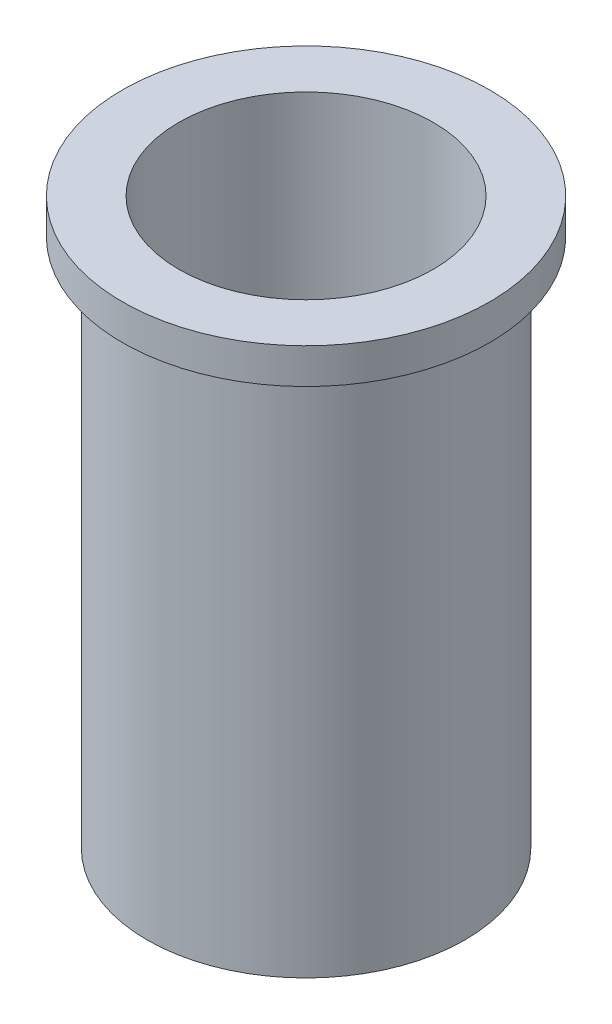
ISO-10303-21;
HEADER;
FILE_DESCRIPTION(('STEP AP214'),'2;1');
FILE_NAME('part.step','',(''),(''),'','','');
FILE_SCHEMA(('AUTOMOTIVE_DESIGN { 1 0 10303 214 1 1 1 1 }'));
ENDSEC;
DATA;
#1=APPLICATION_CONTEXT('core data for automotive mechanical design processes');
#2=APPLICATION_PROTOCOL_DEFINITION('international standard','automotive_design',2000,#1);
#3=PRODUCT_CONTEXT('',#1,'mechanical');
#4=PRODUCT('Part','Part','',(#3));
#5=PRODUCT_RELATED_PRODUCT_CATEGORY('part','',(#4));
#6=PRODUCT_DEFINITION_FORMATION('','',#4);
#7=PRODUCT_DEFINITION_CONTEXT('part definition',#1,'design');
#8=PRODUCT_DEFINITION('design','',#6,#7);
#9=PRODUCT_DEFINITION_SHAPE('','',#8);
#10=(LENGTH_UNIT() NAMED_UNIT(*) SI_UNIT(.MILLI.,.METRE.));
#11=(NAMED_UNIT(*) PLANE_ANGLE_UNIT() SI_UNIT($,.RADIAN.));
#12=(NAMED_UNIT(*) SI_UNIT($,.STERADIAN.) SOLID_ANGLE_UNIT());
#13=UNCERTAINTY_MEASURE_WITH_UNIT(LENGTH_MEASURE(1.E-05),#10,'distance_accuracy_value','');
#14=(GEOMETRIC_REPRESENTATION_CONTEXT(3) GLOBAL_UNCERTAINTY_ASSIGNED_CONTEXT((#13)) GLOBAL_UNIT_ASSIGNED_CONTEXT((#10,
#11,#12)) REPRESENTATION_CONTEXT('',''));
#15=CARTESIAN_POINT('',(0.,0.,0.));
#16=DIRECTION('',(0.,0.,1.));
#17=DIRECTION('',(1.,0.,0.));
#18=AXIS2_PLACEMENT_3D('',#15,#16,#17);
#19=CARTESIAN_POINT('',(16.51,50.8,0.));
#20=DIRECTION('',(0.,1.,0.));
#21=DIRECTION('',(0.,0.,1.));
#22=AXIS2_PLACEMENT_3D('',#19,#20,#21);
#23=PLANE('',#22);
#24=CARTESIAN_POINT('',(0.,50.8,0.));
#25=DIRECTION('',(0.,-1.,0.));
#26=DIRECTION('',(0.,0.,-1.));
#27=AXIS2_PLACEMENT_3D('',#24,#25,#26);
#28=CIRCLE('',#27,11.4457883599263);
#29=CARTESIAN_POINT('',(0.,50.8,-11.4457883599263));
#30=VERTEX_POINT('',#29);
#31=EDGE_CURVE('E10',#30,#30,#28,.T.);
#32=ORIENTED_EDGE('',*,*,#31,.T.);
#33=EDGE_LOOP('',(#32));
#34=FACE_BOUND('',#33,.T.);
#35=CARTESIAN_POINT('',(0.,50.8,0.));
#36=DIRECTION('',(0.,-1.,0.));
#37=DIRECTION('',(0.,0.,-1.));
#38=AXIS2_PLACEMENT_3D('',#35,#36,#37);
#39=CIRCLE('',#38,16.51);
#40=CARTESIAN_POINT('',(0.,50.8,-16.51));
#41=VERTEX_POINT('',#40);
#42=EDGE_CURVE('E53',#41,#41,#39,.T.);
#43=ORIENTED_EDGE('',*,*,#42,.F.);
#44=EDGE_LOOP('',(#43));
#45=FACE_BOUND('',#44,.T.);
#46=ADVANCED_FACE('F31',(#34,#45),#23,.T.);
#47=CARTESIAN_POINT('',(0.,0.,0.));
#48=DIRECTION('',(0.,-1.,0.));
#49=DIRECTION('',(0.,0.,-1.));
#50=AXIS2_PLACEMENT_3D('',#47,#48,#49);
#51=CYLINDRICAL_SURFACE('',#50,11.4457883599263);
#52=CARTESIAN_POINT('',(0.,0.,0.));
#53=DIRECTION('',(0.,-1.,0.));
#54=DIRECTION('',(0.,0.,-1.));
#55=AXIS2_PLACEMENT_3D('',#52,#53,#54);
#56=CIRCLE('',#55,11.4457883599263);
#57=CARTESIAN_POINT('',(0.,0.,-11.4457883599263));
#58=VERTEX_POINT('',#57);
#59=EDGE_CURVE('E37',#58,#58,#56,.T.);
#60=ORIENTED_EDGE('',*,*,#59,.T.);
#61=EDGE_LOOP('',(#60));
#62=FACE_BOUND('',#61,.T.);
#63=ORIENTED_EDGE('',*,*,#31,.F.);
#64=EDGE_LOOP('',(#63));
#65=FACE_BOUND('',#64,.T.);
#66=ADVANCED_FACE('F61',(#62,#65),#51,.F.);
#67=CARTESIAN_POINT('',(11.4457883599263,0.,0.));
#68=DIRECTION('',(0.,-1.,0.));
#69=DIRECTION('',(0.,0.,-1.));
#70=AXIS2_PLACEMENT_3D('',#67,#68,#69);
#71=PLANE('',#70);
#72=CARTESIAN_POINT('',(0.,0.,0.));
#73=DIRECTION('',(0.,-1.,0.));
#74=DIRECTION('',(0.,0.,-1.));
#75=AXIS2_PLACEMENT_3D('',#72,#73,#74);
#76=CIRCLE('',#75,14.2875);
#77=CARTESIAN_POINT('',(0.,0.,-14.2875));
#78=VERTEX_POINT('',#77);
#79=EDGE_CURVE('E41',#78,#78,#76,.T.);
#80=ORIENTED_EDGE('',*,*,#79,.T.);
#81=EDGE_LOOP('',(#80));
#82=FACE_BOUND('',#81,.T.);
#83=ORIENTED_EDGE('',*,*,#59,.F.);
#84=EDGE_LOOP('',(#83));
#85=FACE_BOUND('',#84,.T.);
#86=ADVANCED_FACE('F65',(#82,#85),#71,.T.);
#87=CARTESIAN_POINT('',(0.,0.,0.));
#88=DIRECTION('',(0.,-1.,0.));
#89=DIRECTION('',(0.,0.,-1.));
#90=AXIS2_PLACEMENT_3D('',#87,#88,#89);
#91=CYLINDRICAL_SURFACE('',#90,14.2875);
#92=CARTESIAN_POINT('',(0.,47.625,0.));
#93=DIRECTION('',(0.,-1.,0.));
#94=DIRECTION('',(0.,0.,-1.));
#95=AXIS2_PLACEMENT_3D('',#92,#93,#94);
#96=CIRCLE('',#95,14.2875);
#97=CARTESIAN_POINT('',(0.,47.625,-14.2875));
#98=VERTEX_POINT('',#97);
#99=EDGE_CURVE('E45',#98,#98,#96,.T.);
#100=ORIENTED_EDGE('',*,*,#99,.T.);
#101=EDGE_LOOP('',(#100));
#102=FACE_BOUND('',#101,.T.);
#103=ORIENTED_EDGE('',*,*,#79,.F.);
#104=EDGE_LOOP('',(#103));
#105=FACE_BOUND('',#104,.T.);
#106=ADVANCED_FACE('F69',(#102,#105),#91,.T.);
#107=CARTESIAN_POINT('',(14.2875,47.625,0.));
#108=DIRECTION('',(0.,-1.,0.));
#109=DIRECTION('',(0.,0.,-1.));
#110=AXIS2_PLACEMENT_3D('',#107,#108,#109);
#111=PLANE('',#110);
#112=CARTESIAN_POINT('',(0.,47.625,0.));
#113=DIRECTION('',(0.,-1.,0.));
#114=DIRECTION('',(0.,0.,-1.));
#115=AXIS2_PLACEMENT_3D('',#112,#113,#114);
#116=CIRCLE('',#115,16.51);
#117=CARTESIAN_POINT('',(0.,47.625,-16.51));
#118=VERTEX_POINT('',#117);
#119=EDGE_CURVE('E50',#118,#118,#116,.T.);
#120=ORIENTED_EDGE('',*,*,#119,.T.);
#121=EDGE_LOOP('',(#120));
#122=FACE_BOUND('',#121,.T.);
#123=ORIENTED_EDGE('',*,*,#99,.F.);
#124=EDGE_LOOP('',(#123));
#125=FACE_BOUND('',#124,.T.);
#126=ADVANCED_FACE('F76',(#122,#125),#111,.T.);
#127=CARTESIAN_POINT('',(0.,0.,0.));
#128=DIRECTION('',(0.,-1.,0.));
#129=DIRECTION('',(0.,0.,-1.));
#130=AXIS2_PLACEMENT_3D('',#127,#128,#129);
#131=CYLINDRICAL_SURFACE('',#130,16.51);
#132=ORIENTED_EDGE('',*,*,#42,.T.);
#133=EDGE_LOOP('',(#132));
#134=FACE_BOUND('',#133,.T.);
#135=ORIENTED_EDGE('',*,*,#119,.F.);
#136=EDGE_LOOP('',(#135));
#137=FACE_BOUND('',#136,.T.);
#138=ADVANCED_FACE('F57',(#134,#137),#131,.T.);
#139=CLOSED_SHELL('',(#46,#66,#86,#106,#126,#138));
#140=MANIFOLD_SOLID_BREP('B2',#139);
#141=ADVANCED_BREP_SHAPE_REPRESENTATION('',(#18,#140),#14);
#142=SHAPE_DEFINITION_REPRESENTATION(#9,#141);
ENDSEC;
END-ISO-10303-21;
